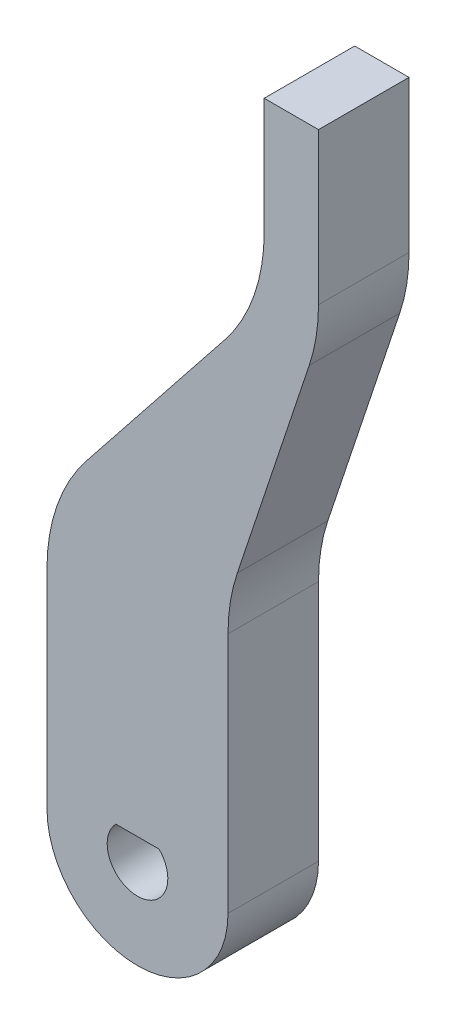
ISO-10303-21;
HEADER;
FILE_DESCRIPTION(('STEP AP214'),'2;1');
FILE_NAME('part.step','',(''),(''),'','','');
FILE_SCHEMA(('AUTOMOTIVE_DESIGN { 1 0 10303 214 1 1 1 1 }'));
ENDSEC;
DATA;
#1=APPLICATION_CONTEXT('core data for automotive mechanical design processes');
#2=APPLICATION_PROTOCOL_DEFINITION('international standard','automotive_design',2000,#1);
#3=PRODUCT_CONTEXT('',#1,'mechanical');
#4=PRODUCT('Part','Part','',(#3));
#5=PRODUCT_RELATED_PRODUCT_CATEGORY('part','',(#4));
#6=PRODUCT_DEFINITION_FORMATION('','',#4);
#7=PRODUCT_DEFINITION_CONTEXT('part definition',#1,'design');
#8=PRODUCT_DEFINITION('design','',#6,#7);
#9=PRODUCT_DEFINITION_SHAPE('','',#8);
#10=(LENGTH_UNIT() NAMED_UNIT(*) SI_UNIT(.MILLI.,.METRE.));
#11=(NAMED_UNIT(*) PLANE_ANGLE_UNIT() SI_UNIT($,.RADIAN.));
#12=(NAMED_UNIT(*) SI_UNIT($,.STERADIAN.) SOLID_ANGLE_UNIT());
#13=UNCERTAINTY_MEASURE_WITH_UNIT(LENGTH_MEASURE(1.E-05),#10,'distance_accuracy_value','');
#14=(GEOMETRIC_REPRESENTATION_CONTEXT(3) GLOBAL_UNCERTAINTY_ASSIGNED_CONTEXT((#13)) GLOBAL_UNIT_ASSIGNED_CONTEXT((#10,
#11,#12)) REPRESENTATION_CONTEXT('',''));
#15=CARTESIAN_POINT('',(0.,0.,0.));
#16=DIRECTION('',(0.,0.,1.));
#17=DIRECTION('',(1.,0.,0.));
#18=AXIS2_PLACEMENT_3D('',#15,#16,#17);
#19=CARTESIAN_POINT('',(0.,0.,5.));
#20=DIRECTION('',(0.,0.,1.));
#21=DIRECTION('',(1.,0.,0.));
#22=AXIS2_PLACEMENT_3D('',#19,#20,#21);
#23=PLANE('',#22);
#24=DIRECTION('',(0.,1.,0.));
#25=VECTOR('',#24,1.);
#26=CARTESIAN_POINT('',(5.,15.,5.));
#27=LINE('',#26,#25);
#28=CARTESIAN_POINT('',(5.,0.,5.));
#29=VERTEX_POINT('',#28);
#30=CARTESIAN_POINT('',(5.,13.3772233983162,5.));
#31=VERTEX_POINT('',#30);
#32=EDGE_CURVE('E179',#29,#31,#27,.T.);
#33=ORIENTED_EDGE('',*,*,#32,.T.);
#34=CARTESIAN_POINT('',(15.,13.3772233983162,5.));
#35=DIRECTION('',(0.,0.,1.));
#36=DIRECTION('',(1.,0.,0.));
#37=AXIS2_PLACEMENT_3D('',#34,#35,#36);
#38=CIRCLE('',#37,10.);
#39=CARTESIAN_POINT('',(5.51316701949486,16.5395010584846,5.));
#40=VERTEX_POINT('',#39);
#41=EDGE_CURVE('E288',#31,#40,#38,.F.);
#42=ORIENTED_EDGE('',*,*,#41,.T.);
#43=DIRECTION('',(0.316227766016838,0.948683298050514,0.));
#44=VECTOR('',#43,1.);
#45=CARTESIAN_POINT('',(10.,30.,5.));
#46=LINE('',#45,#44);
#47=CARTESIAN_POINT('',(9.48683298050513,28.4604989415154,5.));
#48=VERTEX_POINT('',#47);
#49=EDGE_CURVE('E184',#40,#48,#46,.T.);
#50=ORIENTED_EDGE('',*,*,#49,.T.);
#51=CARTESIAN_POINT('',(0.,31.6227766016838,5.));
#52=DIRECTION('',(0.,0.,1.));
#53=DIRECTION('',(1.,0.,0.));
#54=AXIS2_PLACEMENT_3D('',#51,#52,#53);
#55=CIRCLE('',#54,10.);
#56=CARTESIAN_POINT('',(10.,31.6227766016838,5.));
#57=VERTEX_POINT('',#56);
#58=EDGE_CURVE('E261',#48,#57,#55,.T.);
#59=ORIENTED_EDGE('',*,*,#58,.T.);
#60=DIRECTION('',(0.,1.,0.));
#61=VECTOR('',#60,1.);
#62=CARTESIAN_POINT('',(9.99999999999999,40.,5.));
#63=LINE('',#62,#61);
#64=CARTESIAN_POINT('',(9.99999999999999,40.,5.));
#65=VERTEX_POINT('',#64);
#66=EDGE_CURVE('E187',#57,#65,#63,.T.);
#67=ORIENTED_EDGE('',*,*,#66,.T.);
#68=DIRECTION('',(-1.,0.,0.));
#69=VECTOR('',#68,1.);
#70=CARTESIAN_POINT('',(6.99999999999999,40.,5.));
#71=LINE('',#70,#69);
#72=CARTESIAN_POINT('',(6.99999999999999,40.,5.));
#73=VERTEX_POINT('',#72);
#74=EDGE_CURVE('E190',#65,#73,#71,.T.);
#75=ORIENTED_EDGE('',*,*,#74,.T.);
#76=DIRECTION('',(0.,-1.,0.));
#77=VECTOR('',#76,1.);
#78=CARTESIAN_POINT('',(6.99999999999999,40.,5.));
#79=LINE('',#78,#77);
#80=CARTESIAN_POINT('',(7.,33.5865633283797,5.));
#81=VERTEX_POINT('',#80);
#82=EDGE_CURVE('E193',#73,#81,#79,.T.);
#83=ORIENTED_EDGE('',*,*,#82,.T.);
#84=CARTESIAN_POINT('',(-3.,33.5865633283797,5.));
#85=DIRECTION('',(0.,0.,1.));
#86=DIRECTION('',(1.,0.,0.));
#87=AXIS2_PLACEMENT_3D('',#84,#85,#86);
#88=CIRCLE('',#87,10.);
#89=CARTESIAN_POINT('',(4.82812749022182,27.3639899060058,5.));
#90=VERTEX_POINT('',#89);
#91=EDGE_CURVE('E11',#81,#90,#88,.F.);
#92=ORIENTED_EDGE('',*,*,#91,.T.);
#93=DIRECTION('',(-0.622257342237384,-0.782812749022183,0.));
#94=VECTOR('',#93,1.);
#95=CARTESIAN_POINT('',(7.,30.0962509409533,5.));
#96=LINE('',#95,#94);
#97=CARTESIAN_POINT('',(-2.82812749022183,17.7322610349474,5.));
#98=VERTEX_POINT('',#97);
#99=EDGE_CURVE('E196',#90,#98,#96,.T.);
#100=ORIENTED_EDGE('',*,*,#99,.T.);
#101=CARTESIAN_POINT('',(5.,11.5096876125736,5.));
#102=DIRECTION('',(0.,0.,1.));
#103=DIRECTION('',(1.,0.,0.));
#104=AXIS2_PLACEMENT_3D('',#101,#102,#103);
#105=CIRCLE('',#104,10.);
#106=CARTESIAN_POINT('',(-5.,11.5096876125736,5.));
#107=VERTEX_POINT('',#106);
#108=EDGE_CURVE('E258',#98,#107,#105,.T.);
#109=ORIENTED_EDGE('',*,*,#108,.T.);
#110=DIRECTION('',(0.,-1.,0.));
#111=VECTOR('',#110,1.);
#112=CARTESIAN_POINT('',(-5.,0.,5.));
#113=LINE('',#112,#111);
#114=CARTESIAN_POINT('',(-5.,0.,5.));
#115=VERTEX_POINT('',#114);
#116=EDGE_CURVE('E199',#107,#115,#113,.T.);
#117=ORIENTED_EDGE('',*,*,#116,.T.);
#118=CARTESIAN_POINT('',(0.,0.,5.));
#119=DIRECTION('',(0.,0.,1.));
#120=DIRECTION('',(1.,0.,0.));
#121=AXIS2_PLACEMENT_3D('',#118,#119,#120);
#122=CIRCLE('',#121,5.);
#123=EDGE_CURVE('E175',#115,#29,#122,.T.);
#124=ORIENTED_EDGE('',*,*,#123,.T.);
#125=EDGE_LOOP('',(#33,#42,#50,#59,#67,#75,#83,#92,#100,#109,#117,#124));
#126=FACE_BOUND('',#125,.T.);
#127=DIRECTION('',(-1.,0.,0.));
#128=VECTOR('',#127,1.);
#129=CARTESIAN_POINT('',(-1.19373363863133,1.175,5.));
#130=LINE('',#129,#128);
#131=CARTESIAN_POINT('',(1.19373363863133,1.175,5.));
#132=VERTEX_POINT('',#131);
#133=CARTESIAN_POINT('',(-1.19373363863133,1.175,5.));
#134=VERTEX_POINT('',#133);
#135=EDGE_CURVE('E145',#132,#134,#130,.T.);
#136=ORIENTED_EDGE('',*,*,#135,.F.);
#137=CARTESIAN_POINT('',(0.,0.,5.));
#138=DIRECTION('',(0.,0.,1.));
#139=DIRECTION('',(1.,0.,0.));
#140=AXIS2_PLACEMENT_3D('',#137,#138,#139);
#141=CIRCLE('',#140,1.675);
#142=EDGE_CURVE('E156',#134,#132,#141,.T.);
#143=ORIENTED_EDGE('',*,*,#142,.F.);
#144=EDGE_LOOP('',(#136,#143));
#145=FACE_BOUND('',#144,.T.);
#146=ADVANCED_FACE('F43',(#126,#145),#23,.T.);
#147=CARTESIAN_POINT('',(0.,0.,0.));
#148=DIRECTION('',(0.,0.,1.));
#149=DIRECTION('',(1.,0.,0.));
#150=AXIS2_PLACEMENT_3D('',#147,#148,#149);
#151=PLANE('',#150);
#152=DIRECTION('',(0.,1.,0.));
#153=VECTOR('',#152,1.);
#154=CARTESIAN_POINT('',(9.99999999999999,40.,0.));
#155=LINE('',#154,#153);
#156=CARTESIAN_POINT('',(10.,31.6227766016838,0.));
#157=VERTEX_POINT('',#156);
#158=CARTESIAN_POINT('',(9.99999999999999,40.,0.));
#159=VERTEX_POINT('',#158);
#160=EDGE_CURVE('E213',#157,#159,#155,.T.);
#161=ORIENTED_EDGE('',*,*,#160,.F.);
#162=CARTESIAN_POINT('',(0.,31.6227766016838,0.));
#163=DIRECTION('',(0.,0.,1.));
#164=DIRECTION('',(1.,0.,0.));
#165=AXIS2_PLACEMENT_3D('',#162,#163,#164);
#166=CIRCLE('',#165,10.);
#167=CARTESIAN_POINT('',(9.48683298050513,28.4604989415154,0.));
#168=VERTEX_POINT('',#167);
#169=EDGE_CURVE('E250',#157,#168,#166,.F.);
#170=ORIENTED_EDGE('',*,*,#169,.T.);
#171=DIRECTION('',(0.316227766016838,0.948683298050514,0.));
#172=VECTOR('',#171,1.);
#173=CARTESIAN_POINT('',(10.,30.,0.));
#174=LINE('',#173,#172);
#175=CARTESIAN_POINT('',(5.51316701949486,16.5395010584846,0.));
#176=VERTEX_POINT('',#175);
#177=EDGE_CURVE('E210',#176,#168,#174,.T.);
#178=ORIENTED_EDGE('',*,*,#177,.F.);
#179=CARTESIAN_POINT('',(15.,13.3772233983162,0.));
#180=DIRECTION('',(0.,0.,1.));
#181=DIRECTION('',(1.,0.,0.));
#182=AXIS2_PLACEMENT_3D('',#179,#180,#181);
#183=CIRCLE('',#182,10.);
#184=CARTESIAN_POINT('',(5.,13.3772233983162,0.));
#185=VERTEX_POINT('',#184);
#186=EDGE_CURVE('E285',#176,#185,#183,.T.);
#187=ORIENTED_EDGE('',*,*,#186,.T.);
#188=DIRECTION('',(0.,1.,0.));
#189=VECTOR('',#188,1.);
#190=CARTESIAN_POINT('',(5.,15.,0.));
#191=LINE('',#190,#189);
#192=CARTESIAN_POINT('',(5.,0.,0.));
#193=VERTEX_POINT('',#192);
#194=EDGE_CURVE('E206',#193,#185,#191,.T.);
#195=ORIENTED_EDGE('',*,*,#194,.F.);
#196=CARTESIAN_POINT('',(0.,0.,0.));
#197=DIRECTION('',(0.,0.,1.));
#198=DIRECTION('',(1.,0.,0.));
#199=AXIS2_PLACEMENT_3D('',#196,#197,#198);
#200=CIRCLE('',#199,5.);
#201=CARTESIAN_POINT('',(-5.,0.,0.));
#202=VERTEX_POINT('',#201);
#203=EDGE_CURVE('E174',#202,#193,#200,.T.);
#204=ORIENTED_EDGE('',*,*,#203,.F.);
#205=DIRECTION('',(0.,-1.,0.));
#206=VECTOR('',#205,1.);
#207=CARTESIAN_POINT('',(-5.,0.,0.));
#208=LINE('',#207,#206);
#209=CARTESIAN_POINT('',(-5.,11.5096876125736,0.));
#210=VERTEX_POINT('',#209);
#211=EDGE_CURVE('E180',#210,#202,#208,.T.);
#212=ORIENTED_EDGE('',*,*,#211,.F.);
#213=CARTESIAN_POINT('',(5.,11.5096876125736,0.));
#214=DIRECTION('',(0.,0.,1.));
#215=DIRECTION('',(1.,0.,0.));
#216=AXIS2_PLACEMENT_3D('',#213,#214,#215);
#217=CIRCLE('',#216,10.);
#218=CARTESIAN_POINT('',(-2.82812749022183,17.7322610349474,0.));
#219=VERTEX_POINT('',#218);
#220=EDGE_CURVE('E246',#210,#219,#217,.F.);
#221=ORIENTED_EDGE('',*,*,#220,.T.);
#222=DIRECTION('',(-0.622257342237384,-0.782812749022183,0.));
#223=VECTOR('',#222,1.);
#224=CARTESIAN_POINT('',(7.,30.0962509409533,0.));
#225=LINE('',#224,#223);
#226=CARTESIAN_POINT('',(4.82812749022182,27.3639899060058,0.));
#227=VERTEX_POINT('',#226);
#228=EDGE_CURVE('E222',#227,#219,#225,.T.);
#229=ORIENTED_EDGE('',*,*,#228,.F.);
#230=CARTESIAN_POINT('',(-3.,33.5865633283797,0.));
#231=DIRECTION('',(0.,0.,1.));
#232=DIRECTION('',(1.,0.,0.));
#233=AXIS2_PLACEMENT_3D('',#230,#231,#232);
#234=CIRCLE('',#233,10.);
#235=CARTESIAN_POINT('',(7.,33.5865633283797,0.));
#236=VERTEX_POINT('',#235);
#237=EDGE_CURVE('E52',#227,#236,#234,.T.);
#238=ORIENTED_EDGE('',*,*,#237,.T.);
#239=DIRECTION('',(0.,-1.,0.));
#240=VECTOR('',#239,1.);
#241=CARTESIAN_POINT('',(6.99999999999999,40.,0.));
#242=LINE('',#241,#240);
#243=CARTESIAN_POINT('',(6.99999999999999,40.,0.));
#244=VERTEX_POINT('',#243);
#245=EDGE_CURVE('E219',#244,#236,#242,.T.);
#246=ORIENTED_EDGE('',*,*,#245,.F.);
#247=DIRECTION('',(-1.,0.,0.));
#248=VECTOR('',#247,1.);
#249=CARTESIAN_POINT('',(6.99999999999999,40.,0.));
#250=LINE('',#249,#248);
#251=EDGE_CURVE('E216',#159,#244,#250,.T.);
#252=ORIENTED_EDGE('',*,*,#251,.F.);
#253=EDGE_LOOP('',(#161,#170,#178,#187,#195,#204,#212,#221,#229,#238,#246,#252));
#254=FACE_BOUND('',#253,.T.);
#255=CARTESIAN_POINT('',(0.,0.,0.));
#256=DIRECTION('',(0.,0.,1.));
#257=DIRECTION('',(1.,0.,0.));
#258=AXIS2_PLACEMENT_3D('',#255,#256,#257);
#259=CIRCLE('',#258,1.675);
#260=CARTESIAN_POINT('',(-1.19373363863133,1.175,0.));
#261=VERTEX_POINT('',#260);
#262=CARTESIAN_POINT('',(1.19373363863133,1.175,0.));
#263=VERTEX_POINT('',#262);
#264=EDGE_CURVE('E161',#261,#263,#259,.T.);
#265=ORIENTED_EDGE('',*,*,#264,.T.);
#266=DIRECTION('',(-1.,0.,0.));
#267=VECTOR('',#266,1.);
#268=CARTESIAN_POINT('',(-1.19373363863133,1.175,0.));
#269=LINE('',#268,#267);
#270=EDGE_CURVE('E165',#263,#261,#269,.T.);
#271=ORIENTED_EDGE('',*,*,#270,.T.);
#272=EDGE_LOOP('',(#265,#271));
#273=FACE_BOUND('',#272,.T.);
#274=ADVANCED_FACE('F304',(#254,#273),#151,.F.);
#275=CARTESIAN_POINT('',(0.,0.,5.));
#276=DIRECTION('',(0.,0.,-1.));
#277=DIRECTION('',(-1.,0.,0.));
#278=AXIS2_PLACEMENT_3D('',#275,#276,#277);
#279=CYLINDRICAL_SURFACE('',#278,5.);
#280=ORIENTED_EDGE('',*,*,#203,.T.);
#281=DIRECTION('',(0.,0.,-1.));
#282=VECTOR('',#281,1.);
#283=CARTESIAN_POINT('',(5.,0.,5.));
#284=LINE('',#283,#282);
#285=EDGE_CURVE('E238',#29,#193,#284,.T.);
#286=ORIENTED_EDGE('',*,*,#285,.F.);
#287=ORIENTED_EDGE('',*,*,#123,.F.);
#288=DIRECTION('',(0.,0.,-1.));
#289=VECTOR('',#288,1.);
#290=CARTESIAN_POINT('',(-5.,0.,5.));
#291=LINE('',#290,#289);
#292=EDGE_CURVE('E202',#115,#202,#291,.T.);
#293=ORIENTED_EDGE('',*,*,#292,.T.);
#294=EDGE_LOOP('',(#280,#286,#287,#293));
#295=FACE_BOUND('',#294,.T.);
#296=ADVANCED_FACE('F312',(#295),#279,.T.);
#297=CARTESIAN_POINT('',(5.,15.,5.));
#298=DIRECTION('',(-1.,0.,0.));
#299=DIRECTION('',(0.,-1.,0.));
#300=AXIS2_PLACEMENT_3D('',#297,#298,#299);
#301=PLANE('',#300);
#302=ORIENTED_EDGE('',*,*,#194,.T.);
#303=DIRECTION('',(0.,0.,-1.));
#304=VECTOR('',#303,1.);
#305=CARTESIAN_POINT('',(5.,13.3772233983162,5.));
#306=LINE('',#305,#304);
#307=EDGE_CURVE('E276',#185,#31,#306,.F.);
#308=ORIENTED_EDGE('',*,*,#307,.T.);
#309=ORIENTED_EDGE('',*,*,#32,.F.);
#310=ORIENTED_EDGE('',*,*,#285,.T.);
#311=EDGE_LOOP('',(#302,#308,#309,#310));
#312=FACE_BOUND('',#311,.T.);
#313=ADVANCED_FACE('F308',(#312),#301,.F.);
#314=CARTESIAN_POINT('',(10.,30.,5.));
#315=DIRECTION('',(-0.948683298050514,0.316227766016838,0.));
#316=DIRECTION('',(-0.316227766016838,-0.948683298050514,0.));
#317=AXIS2_PLACEMENT_3D('',#314,#315,#316);
#318=PLANE('',#317);
#319=ORIENTED_EDGE('',*,*,#49,.F.);
#320=DIRECTION('',(0.,0.,-1.));
#321=VECTOR('',#320,1.);
#322=CARTESIAN_POINT('',(5.51316701949486,16.5395010584846,0.));
#323=LINE('',#322,#321);
#324=EDGE_CURVE('E272',#40,#176,#323,.T.);
#325=ORIENTED_EDGE('',*,*,#324,.T.);
#326=ORIENTED_EDGE('',*,*,#177,.T.);
#327=DIRECTION('',(0.,0.,-1.));
#328=VECTOR('',#327,1.);
#329=CARTESIAN_POINT('',(9.48683298050513,28.4604989415154,5.));
#330=LINE('',#329,#328);
#331=EDGE_CURVE('E254',#168,#48,#330,.F.);
#332=ORIENTED_EDGE('',*,*,#331,.T.);
#333=EDGE_LOOP('',(#319,#325,#326,#332));
#334=FACE_BOUND('',#333,.T.);
#335=ADVANCED_FACE('F298',(#334),#318,.F.);
#336=CARTESIAN_POINT('',(9.99999999999999,40.,5.));
#337=DIRECTION('',(-1.,0.,0.));
#338=DIRECTION('',(0.,-1.,0.));
#339=AXIS2_PLACEMENT_3D('',#336,#337,#338);
#340=PLANE('',#339);
#341=ORIENTED_EDGE('',*,*,#66,.F.);
#342=DIRECTION('',(0.,0.,-1.));
#343=VECTOR('',#342,1.);
#344=CARTESIAN_POINT('',(10.,31.6227766016838,5.));
#345=LINE('',#344,#343);
#346=EDGE_CURVE('E242',#57,#157,#345,.T.);
#347=ORIENTED_EDGE('',*,*,#346,.T.);
#348=ORIENTED_EDGE('',*,*,#160,.T.);
#349=DIRECTION('',(0.,0.,-1.));
#350=VECTOR('',#349,1.);
#351=CARTESIAN_POINT('',(9.99999999999999,40.,5.));
#352=LINE('',#351,#350);
#353=EDGE_CURVE('E234',#65,#159,#352,.T.);
#354=ORIENTED_EDGE('',*,*,#353,.F.);
#355=EDGE_LOOP('',(#341,#347,#348,#354));
#356=FACE_BOUND('',#355,.T.);
#357=ADVANCED_FACE('F338',(#356),#340,.F.);
#358=CARTESIAN_POINT('',(6.99999999999999,40.,5.));
#359=DIRECTION('',(0.,-1.,0.));
#360=DIRECTION('',(0.,0.,-1.));
#361=AXIS2_PLACEMENT_3D('',#358,#359,#360);
#362=PLANE('',#361);
#363=ORIENTED_EDGE('',*,*,#251,.T.);
#364=DIRECTION('',(0.,0.,-1.));
#365=VECTOR('',#364,1.);
#366=CARTESIAN_POINT('',(6.99999999999999,40.,5.));
#367=LINE('',#366,#365);
#368=EDGE_CURVE('E230',#73,#244,#367,.T.);
#369=ORIENTED_EDGE('',*,*,#368,.F.);
#370=ORIENTED_EDGE('',*,*,#74,.F.);
#371=ORIENTED_EDGE('',*,*,#353,.T.);
#372=EDGE_LOOP('',(#363,#369,#370,#371));
#373=FACE_BOUND('',#372,.T.);
#374=ADVANCED_FACE('F334',(#373),#362,.F.);
#375=CARTESIAN_POINT('',(6.99999999999999,40.,5.));
#376=DIRECTION('',(1.,0.,0.));
#377=DIRECTION('',(0.,1.,0.));
#378=AXIS2_PLACEMENT_3D('',#375,#376,#377);
#379=PLANE('',#378);
#380=ORIENTED_EDGE('',*,*,#245,.T.);
#381=DIRECTION('',(0.,0.,-1.));
#382=VECTOR('',#381,1.);
#383=CARTESIAN_POINT('',(7.,33.5865633283797,5.));
#384=LINE('',#383,#382);
#385=EDGE_CURVE('E59',#236,#81,#384,.F.);
#386=ORIENTED_EDGE('',*,*,#385,.T.);
#387=ORIENTED_EDGE('',*,*,#82,.F.);
#388=ORIENTED_EDGE('',*,*,#368,.T.);
#389=EDGE_LOOP('',(#380,#386,#387,#388));
#390=FACE_BOUND('',#389,.T.);
#391=ADVANCED_FACE('F331',(#390),#379,.F.);
#392=CARTESIAN_POINT('',(7.,30.0962509409533,5.));
#393=DIRECTION('',(0.782812749022183,-0.622257342237384,0.));
#394=DIRECTION('',(0.622257342237384,0.782812749022183,0.));
#395=AXIS2_PLACEMENT_3D('',#392,#393,#394);
#396=PLANE('',#395);
#397=ORIENTED_EDGE('',*,*,#99,.F.);
#398=DIRECTION('',(0.,0.,-1.));
#399=VECTOR('',#398,1.);
#400=CARTESIAN_POINT('',(4.82812749022182,27.3639899060058,0.));
#401=LINE('',#400,#399);
#402=EDGE_CURVE('E279',#90,#227,#401,.T.);
#403=ORIENTED_EDGE('',*,*,#402,.T.);
#404=ORIENTED_EDGE('',*,*,#228,.T.);
#405=DIRECTION('',(0.,0.,-1.));
#406=VECTOR('',#405,1.);
#407=CARTESIAN_POINT('',(-2.82812749022183,17.7322610349474,5.));
#408=LINE('',#407,#406);
#409=EDGE_CURVE('E268',#219,#98,#408,.F.);
#410=ORIENTED_EDGE('',*,*,#409,.T.);
#411=EDGE_LOOP('',(#397,#403,#404,#410));
#412=FACE_BOUND('',#411,.T.);
#413=ADVANCED_FACE('F325',(#412),#396,.F.);
#414=CARTESIAN_POINT('',(-5.,0.,5.));
#415=DIRECTION('',(1.,0.,0.));
#416=DIRECTION('',(0.,1.,0.));
#417=AXIS2_PLACEMENT_3D('',#414,#415,#416);
#418=PLANE('',#417);
#419=ORIENTED_EDGE('',*,*,#116,.F.);
#420=DIRECTION('',(0.,0.,-1.));
#421=VECTOR('',#420,1.);
#422=CARTESIAN_POINT('',(-5.,11.5096876125736,5.));
#423=LINE('',#422,#421);
#424=EDGE_CURVE('E264',#107,#210,#423,.T.);
#425=ORIENTED_EDGE('',*,*,#424,.T.);
#426=ORIENTED_EDGE('',*,*,#211,.T.);
#427=ORIENTED_EDGE('',*,*,#292,.F.);
#428=EDGE_LOOP('',(#419,#425,#426,#427));
#429=FACE_BOUND('',#428,.T.);
#430=ADVANCED_FACE('F318',(#429),#418,.F.);
#431=CARTESIAN_POINT('',(0.,0.,5.));
#432=DIRECTION('',(0.,0.,-1.));
#433=DIRECTION('',(-1.,0.,0.));
#434=AXIS2_PLACEMENT_3D('',#431,#432,#433);
#435=CYLINDRICAL_SURFACE('',#434,1.675);
#436=ORIENTED_EDGE('',*,*,#264,.F.);
#437=DIRECTION('',(0.,0.,-1.));
#438=VECTOR('',#437,1.);
#439=CARTESIAN_POINT('',(-1.19373363863133,1.175,5.));
#440=LINE('',#439,#438);
#441=EDGE_CURVE('E148',#134,#261,#440,.T.);
#442=ORIENTED_EDGE('',*,*,#441,.F.);
#443=ORIENTED_EDGE('',*,*,#142,.T.);
#444=DIRECTION('',(0.,0.,-1.));
#445=VECTOR('',#444,1.);
#446=CARTESIAN_POINT('',(1.19373363863133,1.175,5.));
#447=LINE('',#446,#445);
#448=EDGE_CURVE('E151',#132,#263,#447,.T.);
#449=ORIENTED_EDGE('',*,*,#448,.T.);
#450=EDGE_LOOP('',(#436,#442,#443,#449));
#451=FACE_BOUND('',#450,.T.);
#452=ADVANCED_FACE('F159',(#451),#435,.F.);
#453=CARTESIAN_POINT('',(-1.19373363863133,1.175,5.));
#454=DIRECTION('',(0.,-1.,0.));
#455=DIRECTION('',(0.,0.,-1.));
#456=AXIS2_PLACEMENT_3D('',#453,#454,#455);
#457=PLANE('',#456);
#458=ORIENTED_EDGE('',*,*,#270,.F.);
#459=ORIENTED_EDGE('',*,*,#448,.F.);
#460=ORIENTED_EDGE('',*,*,#135,.T.);
#461=ORIENTED_EDGE('',*,*,#441,.T.);
#462=EDGE_LOOP('',(#458,#459,#460,#461));
#463=FACE_BOUND('',#462,.T.);
#464=ADVANCED_FACE('F147',(#463),#457,.T.);
#465=CARTESIAN_POINT('',(0.,31.6227766016838,5.));
#466=DIRECTION('',(0.,0.,-1.));
#467=DIRECTION('',(-1.,0.,0.));
#468=AXIS2_PLACEMENT_3D('',#465,#466,#467);
#469=CYLINDRICAL_SURFACE('',#468,10.);
#470=ORIENTED_EDGE('',*,*,#58,.F.);
#471=ORIENTED_EDGE('',*,*,#331,.F.);
#472=ORIENTED_EDGE('',*,*,#169,.F.);
#473=ORIENTED_EDGE('',*,*,#346,.F.);
#474=EDGE_LOOP('',(#470,#471,#472,#473));
#475=FACE_BOUND('',#474,.T.);
#476=ADVANCED_FACE('F341',(#475),#469,.T.);
#477=CARTESIAN_POINT('',(5.,11.5096876125736,5.));
#478=DIRECTION('',(0.,0.,-1.));
#479=DIRECTION('',(-1.,0.,0.));
#480=AXIS2_PLACEMENT_3D('',#477,#478,#479);
#481=CYLINDRICAL_SURFACE('',#480,10.);
#482=ORIENTED_EDGE('',*,*,#108,.F.);
#483=ORIENTED_EDGE('',*,*,#409,.F.);
#484=ORIENTED_EDGE('',*,*,#220,.F.);
#485=ORIENTED_EDGE('',*,*,#424,.F.);
#486=EDGE_LOOP('',(#482,#483,#484,#485));
#487=FACE_BOUND('',#486,.T.);
#488=ADVANCED_FACE('F322',(#487),#481,.T.);
#489=CARTESIAN_POINT('',(15.,13.3772233983162,5.));
#490=DIRECTION('',(0.,0.,1.));
#491=DIRECTION('',(1.,0.,0.));
#492=AXIS2_PLACEMENT_3D('',#489,#490,#491);
#493=CYLINDRICAL_SURFACE('',#492,10.);
#494=ORIENTED_EDGE('',*,*,#41,.F.);
#495=ORIENTED_EDGE('',*,*,#307,.F.);
#496=ORIENTED_EDGE('',*,*,#186,.F.);
#497=ORIENTED_EDGE('',*,*,#324,.F.);
#498=EDGE_LOOP('',(#494,#495,#496,#497));
#499=FACE_BOUND('',#498,.T.);
#500=ADVANCED_FACE('F302',(#499),#493,.F.);
#501=CARTESIAN_POINT('',(-3.,33.5865633283797,5.));
#502=DIRECTION('',(0.,0.,1.));
#503=DIRECTION('',(1.,0.,0.));
#504=AXIS2_PLACEMENT_3D('',#501,#502,#503);
#505=CYLINDRICAL_SURFACE('',#504,10.);
#506=ORIENTED_EDGE('',*,*,#91,.F.);
#507=ORIENTED_EDGE('',*,*,#385,.F.);
#508=ORIENTED_EDGE('',*,*,#237,.F.);
#509=ORIENTED_EDGE('',*,*,#402,.F.);
#510=EDGE_LOOP('',(#506,#507,#508,#509));
#511=FACE_BOUND('',#510,.T.);
#512=ADVANCED_FACE('F45',(#511),#505,.F.);
#513=CLOSED_SHELL('',(#146,#274,#296,#313,#335,#357,#374,#391,#413,#430,#452,#464,#476,#488,
#500,#512));
#514=MANIFOLD_SOLID_BREP('B2',#513);
#515=ADVANCED_BREP_SHAPE_REPRESENTATION('',(#18,#514),#14);
#516=SHAPE_DEFINITION_REPRESENTATION(#9,#515);
ENDSEC;
END-ISO-10303-21;
